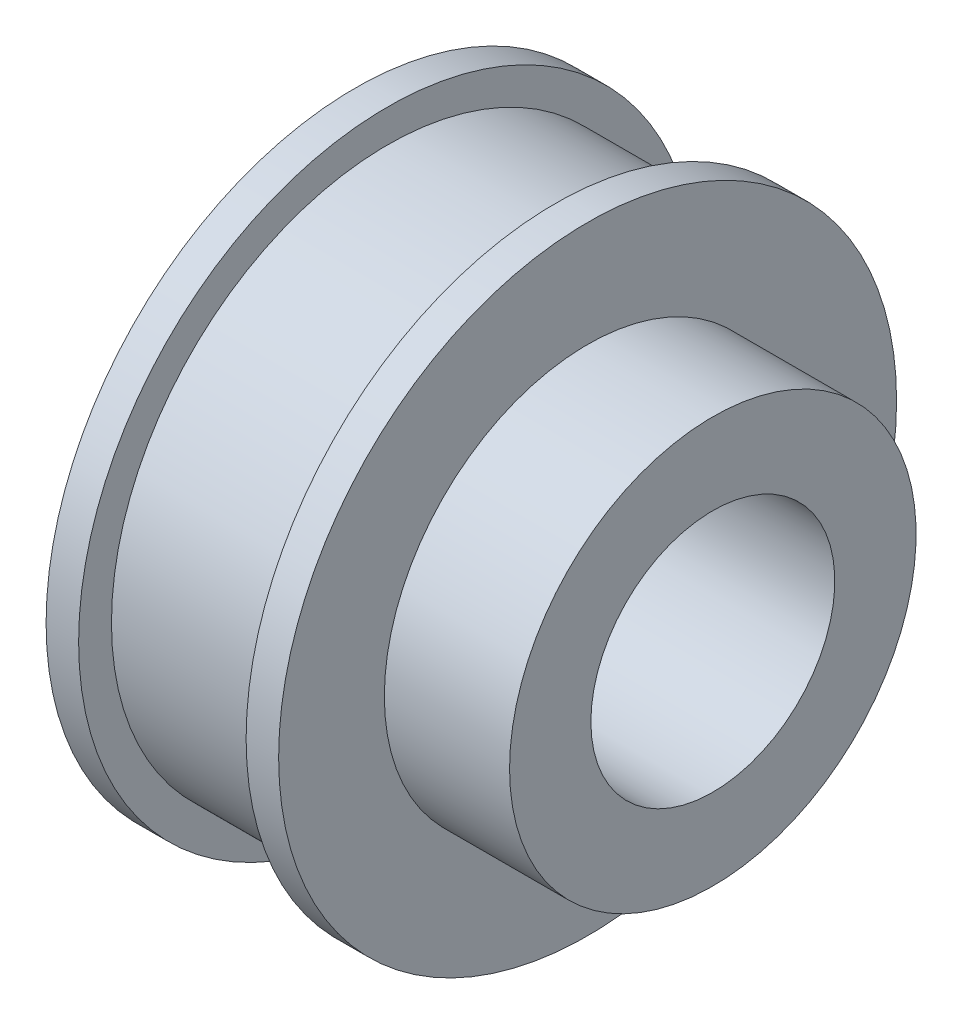
ISO-10303-21;
HEADER;
FILE_DESCRIPTION(('STEP AP214'),'2;1');
FILE_NAME('part.step','',(''),(''),'','','');
FILE_SCHEMA(('AUTOMOTIVE_DESIGN { 1 0 10303 214 1 1 1 1 }'));
ENDSEC;
DATA;
#1=APPLICATION_CONTEXT('core data for automotive mechanical design processes');
#2=APPLICATION_PROTOCOL_DEFINITION('international standard','automotive_design',2000,#1);
#3=PRODUCT_CONTEXT('',#1,'mechanical');
#4=PRODUCT('Part','Part','',(#3));
#5=PRODUCT_RELATED_PRODUCT_CATEGORY('part','',(#4));
#6=PRODUCT_DEFINITION_FORMATION('','',#4);
#7=PRODUCT_DEFINITION_CONTEXT('part definition',#1,'design');
#8=PRODUCT_DEFINITION('design','',#6,#7);
#9=PRODUCT_DEFINITION_SHAPE('','',#8);
#10=(LENGTH_UNIT() NAMED_UNIT(*) SI_UNIT(.MILLI.,.METRE.));
#11=(NAMED_UNIT(*) PLANE_ANGLE_UNIT() SI_UNIT($,.RADIAN.));
#12=(NAMED_UNIT(*) SI_UNIT($,.STERADIAN.) SOLID_ANGLE_UNIT());
#13=UNCERTAINTY_MEASURE_WITH_UNIT(LENGTH_MEASURE(1.E-05),#10,'distance_accuracy_value','');
#14=(GEOMETRIC_REPRESENTATION_CONTEXT(3) GLOBAL_UNCERTAINTY_ASSIGNED_CONTEXT((#13)) GLOBAL_UNIT_ASSIGNED_CONTEXT((#10,
#11,#12)) REPRESENTATION_CONTEXT('',''));
#15=CARTESIAN_POINT('',(0.,0.,0.));
#16=DIRECTION('',(0.,0.,1.));
#17=DIRECTION('',(1.,0.,0.));
#18=AXIS2_PLACEMENT_3D('',#15,#16,#17);
#19=CARTESIAN_POINT('',(0.,0.,0.));
#20=DIRECTION('',(-1.,0.,0.));
#21=DIRECTION('',(0.,0.,1.));
#22=AXIS2_PLACEMENT_3D('',#19,#20,#21);
#23=CYLINDRICAL_SURFACE('',#22,7.5);
#24=CARTESIAN_POINT('',(22.,0.,0.));
#25=DIRECTION('',(-1.,0.,0.));
#26=DIRECTION('',(0.,0.,1.));
#27=AXIS2_PLACEMENT_3D('',#24,#25,#26);
#28=CIRCLE('',#27,7.5);
#29=CARTESIAN_POINT('',(22.,0.,7.5));
#30=VERTEX_POINT('',#29);
#31=EDGE_CURVE('E10',#30,#30,#28,.T.);
#32=ORIENTED_EDGE('',*,*,#31,.F.);
#33=EDGE_LOOP('',(#32));
#34=FACE_BOUND('',#33,.T.);
#35=CARTESIAN_POINT('',(0.,0.,0.));
#36=DIRECTION('',(-1.,0.,0.));
#37=DIRECTION('',(0.,0.,1.));
#38=AXIS2_PLACEMENT_3D('',#35,#36,#37);
#39=CIRCLE('',#38,7.5);
#40=CARTESIAN_POINT('',(0.,0.,7.5));
#41=VERTEX_POINT('',#40);
#42=EDGE_CURVE('E65',#41,#41,#39,.T.);
#43=ORIENTED_EDGE('',*,*,#42,.T.);
#44=EDGE_LOOP('',(#43));
#45=FACE_BOUND('',#44,.T.);
#46=ADVANCED_FACE('F31',(#34,#45),#23,.F.);
#47=CARTESIAN_POINT('',(22.,7.5,0.));
#48=DIRECTION('',(-1.,0.,0.));
#49=DIRECTION('',(0.,0.,1.));
#50=AXIS2_PLACEMENT_3D('',#47,#48,#49);
#51=PLANE('',#50);
#52=CARTESIAN_POINT('',(22.,0.,0.));
#53=DIRECTION('',(-1.,0.,0.));
#54=DIRECTION('',(0.,0.,1.));
#55=AXIS2_PLACEMENT_3D('',#52,#53,#54);
#56=CIRCLE('',#55,12.5);
#57=CARTESIAN_POINT('',(22.,0.,12.5));
#58=VERTEX_POINT('',#57);
#59=EDGE_CURVE('E37',#58,#58,#56,.T.);
#60=ORIENTED_EDGE('',*,*,#59,.F.);
#61=EDGE_LOOP('',(#60));
#62=FACE_BOUND('',#61,.T.);
#63=ORIENTED_EDGE('',*,*,#31,.T.);
#64=EDGE_LOOP('',(#63));
#65=FACE_BOUND('',#64,.T.);
#66=ADVANCED_FACE('F114',(#62,#65),#51,.F.);
#67=CARTESIAN_POINT('',(0.,0.,0.));
#68=DIRECTION('',(-1.,0.,0.));
#69=DIRECTION('',(0.,0.,1.));
#70=AXIS2_PLACEMENT_3D('',#67,#68,#69);
#71=CYLINDRICAL_SURFACE('',#70,12.5);
#72=CARTESIAN_POINT('',(14.3,0.,0.));
#73=DIRECTION('',(-1.,0.,0.));
#74=DIRECTION('',(0.,0.,1.));
#75=AXIS2_PLACEMENT_3D('',#72,#73,#74);
#76=CIRCLE('',#75,12.5);
#77=CARTESIAN_POINT('',(14.3,0.,12.5));
#78=VERTEX_POINT('',#77);
#79=EDGE_CURVE('E41',#78,#78,#76,.T.);
#80=ORIENTED_EDGE('',*,*,#79,.F.);
#81=EDGE_LOOP('',(#80));
#82=FACE_BOUND('',#81,.T.);
#83=ORIENTED_EDGE('',*,*,#59,.T.);
#84=EDGE_LOOP('',(#83));
#85=FACE_BOUND('',#84,.T.);
#86=ADVANCED_FACE('F109',(#82,#85),#71,.T.);
#87=CARTESIAN_POINT('',(14.3,12.5,0.));
#88=DIRECTION('',(-1.,0.,0.));
#89=DIRECTION('',(0.,0.,1.));
#90=AXIS2_PLACEMENT_3D('',#87,#88,#89);
#91=PLANE('',#90);
#92=CARTESIAN_POINT('',(14.3,0.,0.));
#93=DIRECTION('',(-1.,0.,0.));
#94=DIRECTION('',(0.,0.,1.));
#95=AXIS2_PLACEMENT_3D('',#92,#93,#94);
#96=CIRCLE('',#95,19.);
#97=CARTESIAN_POINT('',(14.3,0.,19.));
#98=VERTEX_POINT('',#97);
#99=EDGE_CURVE('E45',#98,#98,#96,.T.);
#100=ORIENTED_EDGE('',*,*,#99,.F.);
#101=EDGE_LOOP('',(#100));
#102=FACE_BOUND('',#101,.T.);
#103=ORIENTED_EDGE('',*,*,#79,.T.);
#104=EDGE_LOOP('',(#103));
#105=FACE_BOUND('',#104,.T.);
#106=ADVANCED_FACE('F103',(#102,#105),#91,.F.);
#107=CARTESIAN_POINT('',(0.,0.,0.));
#108=DIRECTION('',(-1.,0.,0.));
#109=DIRECTION('',(0.,0.,1.));
#110=AXIS2_PLACEMENT_3D('',#107,#108,#109);
#111=CYLINDRICAL_SURFACE('',#110,19.);
#112=CARTESIAN_POINT('',(12.3,0.,0.));
#113=DIRECTION('',(-1.,0.,0.));
#114=DIRECTION('',(0.,0.,1.));
#115=AXIS2_PLACEMENT_3D('',#112,#113,#114);
#116=CIRCLE('',#115,19.);
#117=CARTESIAN_POINT('',(12.3,0.,19.));
#118=VERTEX_POINT('',#117);
#119=EDGE_CURVE('E50',#118,#118,#116,.T.);
#120=ORIENTED_EDGE('',*,*,#119,.F.);
#121=EDGE_LOOP('',(#120));
#122=FACE_BOUND('',#121,.T.);
#123=ORIENTED_EDGE('',*,*,#99,.T.);
#124=EDGE_LOOP('',(#123));
#125=FACE_BOUND('',#124,.T.);
#126=ADVANCED_FACE('F97',(#122,#125),#111,.T.);
#127=CARTESIAN_POINT('',(12.3,19.,0.));
#128=DIRECTION('',(1.,0.,0.));
#129=DIRECTION('',(0.,0.,-1.));
#130=AXIS2_PLACEMENT_3D('',#127,#128,#129);
#131=PLANE('',#130);
#132=CARTESIAN_POINT('',(12.3,0.,0.));
#133=DIRECTION('',(-1.,0.,0.));
#134=DIRECTION('',(0.,0.,1.));
#135=AXIS2_PLACEMENT_3D('',#132,#133,#134);
#136=CIRCLE('',#135,16.98);
#137=CARTESIAN_POINT('',(12.3,0.,16.98));
#138=VERTEX_POINT('',#137);
#139=EDGE_CURVE('E53',#138,#138,#136,.T.);
#140=ORIENTED_EDGE('',*,*,#139,.F.);
#141=EDGE_LOOP('',(#140));
#142=FACE_BOUND('',#141,.T.);
#143=ORIENTED_EDGE('',*,*,#119,.T.);
#144=EDGE_LOOP('',(#143));
#145=FACE_BOUND('',#144,.T.);
#146=ADVANCED_FACE('F91',(#142,#145),#131,.F.);
#147=CARTESIAN_POINT('',(0.,0.,0.));
#148=DIRECTION('',(-1.,0.,0.));
#149=DIRECTION('',(0.,0.,1.));
#150=AXIS2_PLACEMENT_3D('',#147,#148,#149);
#151=CYLINDRICAL_SURFACE('',#150,16.98);
#152=CARTESIAN_POINT('',(2.,0.,0.));
#153=DIRECTION('',(-1.,0.,0.));
#154=DIRECTION('',(0.,0.,1.));
#155=AXIS2_PLACEMENT_3D('',#152,#153,#154);
#156=CIRCLE('',#155,16.98);
#157=CARTESIAN_POINT('',(2.,0.,16.98));
#158=VERTEX_POINT('',#157);
#159=EDGE_CURVE('E56',#158,#158,#156,.T.);
#160=ORIENTED_EDGE('',*,*,#159,.F.);
#161=EDGE_LOOP('',(#160));
#162=FACE_BOUND('',#161,.T.);
#163=ORIENTED_EDGE('',*,*,#139,.T.);
#164=EDGE_LOOP('',(#163));
#165=FACE_BOUND('',#164,.T.);
#166=ADVANCED_FACE('F85',(#162,#165),#151,.T.);
#167=CARTESIAN_POINT('',(2.,19.,0.));
#168=DIRECTION('',(-1.,0.,0.));
#169=DIRECTION('',(0.,0.,1.));
#170=AXIS2_PLACEMENT_3D('',#167,#168,#169);
#171=PLANE('',#170);
#172=CARTESIAN_POINT('',(2.,0.,0.));
#173=DIRECTION('',(-1.,0.,0.));
#174=DIRECTION('',(0.,0.,1.));
#175=AXIS2_PLACEMENT_3D('',#172,#173,#174);
#176=CIRCLE('',#175,19.);
#177=CARTESIAN_POINT('',(2.,0.,19.));
#178=VERTEX_POINT('',#177);
#179=EDGE_CURVE('E59',#178,#178,#176,.T.);
#180=ORIENTED_EDGE('',*,*,#179,.F.);
#181=EDGE_LOOP('',(#180));
#182=FACE_BOUND('',#181,.T.);
#183=ORIENTED_EDGE('',*,*,#159,.T.);
#184=EDGE_LOOP('',(#183));
#185=FACE_BOUND('',#184,.T.);
#186=ADVANCED_FACE('F79',(#182,#185),#171,.F.);
#187=CARTESIAN_POINT('',(0.,0.,0.));
#188=DIRECTION('',(-1.,0.,0.));
#189=DIRECTION('',(0.,0.,1.));
#190=AXIS2_PLACEMENT_3D('',#187,#188,#189);
#191=CYLINDRICAL_SURFACE('',#190,19.);
#192=CARTESIAN_POINT('',(0.,0.,0.));
#193=DIRECTION('',(-1.,0.,0.));
#194=DIRECTION('',(0.,0.,1.));
#195=AXIS2_PLACEMENT_3D('',#192,#193,#194);
#196=CIRCLE('',#195,19.);
#197=CARTESIAN_POINT('',(0.,0.,19.));
#198=VERTEX_POINT('',#197);
#199=EDGE_CURVE('E62',#198,#198,#196,.T.);
#200=ORIENTED_EDGE('',*,*,#199,.F.);
#201=EDGE_LOOP('',(#200));
#202=FACE_BOUND('',#201,.T.);
#203=ORIENTED_EDGE('',*,*,#179,.T.);
#204=EDGE_LOOP('',(#203));
#205=FACE_BOUND('',#204,.T.);
#206=ADVANCED_FACE('F73',(#202,#205),#191,.T.);
#207=CARTESIAN_POINT('',(0.,19.,0.));
#208=DIRECTION('',(1.,0.,0.));
#209=DIRECTION('',(0.,0.,-1.));
#210=AXIS2_PLACEMENT_3D('',#207,#208,#209);
#211=PLANE('',#210);
#212=ORIENTED_EDGE('',*,*,#42,.F.);
#213=EDGE_LOOP('',(#212));
#214=FACE_BOUND('',#213,.T.);
#215=ORIENTED_EDGE('',*,*,#199,.T.);
#216=EDGE_LOOP('',(#215));
#217=FACE_BOUND('',#216,.T.);
#218=ADVANCED_FACE('F70',(#214,#217),#211,.F.);
#219=CLOSED_SHELL('',(#46,#66,#86,#106,#126,#146,#166,#186,#206,#218));
#220=MANIFOLD_SOLID_BREP('B2',#219);
#221=ADVANCED_BREP_SHAPE_REPRESENTATION('',(#18,#220),#14);
#222=SHAPE_DEFINITION_REPRESENTATION(#9,#221);
ENDSEC;
END-ISO-10303-21;
